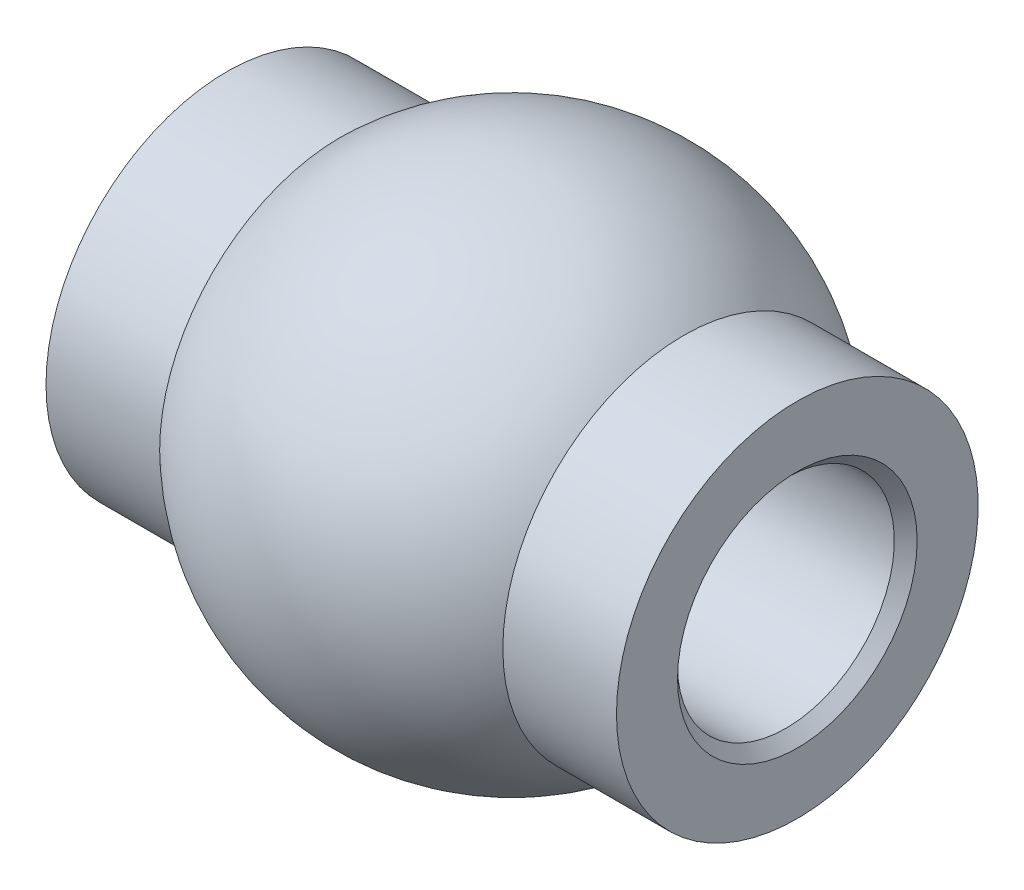
ISO-10303-21;
HEADER;
FILE_DESCRIPTION(('STEP AP214'),'2;1');
FILE_NAME('part.step','',(''),(''),'','','');
FILE_SCHEMA(('AUTOMOTIVE_DESIGN { 1 0 10303 214 1 1 1 1 }'));
ENDSEC;
DATA;
#1=APPLICATION_CONTEXT('core data for automotive mechanical design processes');
#2=APPLICATION_PROTOCOL_DEFINITION('international standard','automotive_design',2000,#1);
#3=PRODUCT_CONTEXT('',#1,'mechanical');
#4=PRODUCT('Part','Part','',(#3));
#5=PRODUCT_RELATED_PRODUCT_CATEGORY('part','',(#4));
#6=PRODUCT_DEFINITION_FORMATION('','',#4);
#7=PRODUCT_DEFINITION_CONTEXT('part definition',#1,'design');
#8=PRODUCT_DEFINITION('design','',#6,#7);
#9=PRODUCT_DEFINITION_SHAPE('','',#8);
#10=(LENGTH_UNIT() NAMED_UNIT(*) SI_UNIT(.MILLI.,.METRE.));
#11=(NAMED_UNIT(*) PLANE_ANGLE_UNIT() SI_UNIT($,.RADIAN.));
#12=(NAMED_UNIT(*) SI_UNIT($,.STERADIAN.) SOLID_ANGLE_UNIT());
#13=UNCERTAINTY_MEASURE_WITH_UNIT(LENGTH_MEASURE(1.E-05),#10,'distance_accuracy_value','');
#14=(GEOMETRIC_REPRESENTATION_CONTEXT(3) GLOBAL_UNCERTAINTY_ASSIGNED_CONTEXT((#13)) GLOBAL_UNIT_ASSIGNED_CONTEXT((#10,
#11,#12)) REPRESENTATION_CONTEXT('',''));
#15=CARTESIAN_POINT('',(0.,0.,0.));
#16=DIRECTION('',(0.,0.,1.));
#17=DIRECTION('',(1.,0.,0.));
#18=AXIS2_PLACEMENT_3D('',#15,#16,#17);
#19=CARTESIAN_POINT('',(-18.1576372828576,0.,0.));
#20=DIRECTION('',(-1.,0.,0.));
#21=DIRECTION('',(0.,0.,1.));
#22=AXIS2_PLACEMENT_3D('',#19,#20,#21);
#23=CYLINDRICAL_SURFACE('',#22,4.0259);
#24=CARTESIAN_POINT('',(-6.35,0.,0.));
#25=DIRECTION('',(-1.,0.,0.));
#26=DIRECTION('',(0.,0.,1.));
#27=AXIS2_PLACEMENT_3D('',#24,#25,#26);
#28=CIRCLE('',#27,4.0259);
#29=CARTESIAN_POINT('',(-6.35,0.,4.0259));
#30=VERTEX_POINT('',#29);
#31=EDGE_CURVE('E73',#30,#30,#28,.T.);
#32=ORIENTED_EDGE('',*,*,#31,.F.);
#33=EDGE_LOOP('',(#32));
#34=FACE_BOUND('',#33,.T.);
#35=CARTESIAN_POINT('',(-3.82014648933781,0.,0.));
#36=DIRECTION('',(-1.,0.,0.));
#37=DIRECTION('',(0.,0.,1.));
#38=AXIS2_PLACEMENT_3D('',#35,#36,#37);
#39=CIRCLE('',#38,4.0259);
#40=CARTESIAN_POINT('',(-3.82014648933781,4.0259,0.));
#41=VERTEX_POINT('',#40);
#42=EDGE_CURVE('E61',#41,#41,#39,.T.);
#43=ORIENTED_EDGE('',*,*,#42,.T.);
#44=EDGE_LOOP('',(#43));
#45=FACE_BOUND('',#44,.T.);
#46=ADVANCED_FACE('F37',(#34,#45),#23,.T.);
#47=CARTESIAN_POINT('',(0.,0.,0.));
#48=DIRECTION('',(-1.,0.,0.));
#49=DIRECTION('',(0.,1.,0.));
#50=AXIS2_PLACEMENT_3D('',#47,#48,#49);
#51=SPHERICAL_SURFACE('',#50,5.5499);
#52=CARTESIAN_POINT('',(3.82014648933781,0.,0.));
#53=DIRECTION('',(-1.,0.,0.));
#54=DIRECTION('',(0.,0.,1.));
#55=AXIS2_PLACEMENT_3D('',#52,#53,#54);
#56=CIRCLE('',#55,4.0259);
#57=CARTESIAN_POINT('',(3.82014648933781,4.0259,0.));
#58=VERTEX_POINT('',#57);
#59=EDGE_CURVE('E65',#58,#58,#56,.T.);
#60=CARTESIAN_POINT('',(-3.82014648933781,4.0259,0.));
#61=CARTESIAN_POINT('',(-3.75647292256511,4.08632169117995,0.));
#62=CARTESIAN_POINT('',(-3.69136374480787,4.14523024825536,0.));
#63=CARTESIAN_POINT('',(-3.5584255541697,4.25989409112417,0.));
#64=CARTESIAN_POINT('',(-3.49059654128878,4.31564937691756,0.));
#65=CARTESIAN_POINT('',(-3.35237006724862,4.42387967414934,0.));
#66=CARTESIAN_POINT('',(-3.2819726060894,4.47635468558773,0.));
#67=CARTESIAN_POINT('',(-3.13876804427305,4.57790671669038,0.));
#68=CARTESIAN_POINT('',(-3.06596094361593,4.62698373635464,0.));
#69=CARTESIAN_POINT('',(-2.91810089603688,4.721629205639,0.));
#70=CARTESIAN_POINT('',(-2.84304794911496,4.76719765525911,0.));
#71=CARTESIAN_POINT('',(-2.69086517533641,4.85472344039663,0.));
#72=CARTESIAN_POINT('',(-2.61373534847979,4.89668077591405,0.));
#73=CARTESIAN_POINT('',(-2.45757242458394,4.97688988068548,0.));
#74=CARTESIAN_POINT('',(-2.37853932754471,5.01514164993949,0.));
#75=CARTESIAN_POINT('',(-2.21874776568355,5.08785352092132,0.));
#76=CARTESIAN_POINT('',(-2.13798930086161,5.12231362264914,0.));
#77=CARTESIAN_POINT('',(-1.97492878730888,5.18736458959396,0.));
#78=CARTESIAN_POINT('',(-1.8926267385781,5.21795545481094,0.));
#79=CARTESIAN_POINT('',(-1.72666431623966,5.27519908996329,0.));
#80=CARTESIAN_POINT('',(-1.643003942632,5.30185185989864,0.));
#81=CARTESIAN_POINT('',(-1.47451318694876,5.35115931003686,0.));
#82=CARTESIAN_POINT('',(-1.38968280487317,5.37381399023972,0.));
#83=CARTESIAN_POINT('',(-1.21904298235289,5.41507426606648,0.));
#84=CARTESIAN_POINT('',(-1.1332335419082,5.43367986169039,0.));
#85=CARTESIAN_POINT('',(-0.960828756561464,5.46680008784064,0.));
#86=CARTESIAN_POINT('',(-0.874233411659423,5.48131471836699,0.));
#87=CARTESIAN_POINT('',(-0.700451740355089,5.50622034242008,0.));
#88=CARTESIAN_POINT('',(-0.613265413952796,5.51661133594681,0.));
#89=CARTESIAN_POINT('',(-0.438498032881969,5.53324629625381,0.));
#90=CARTESIAN_POINT('',(-0.350916978213436,5.53949026303407,0.));
#91=CARTESIAN_POINT('',(-0.175557282363269,5.54781711490717,0.));
#92=CARTESIAN_POINT('',(-0.0877786411816341,5.5499,0.));
#93=CARTESIAN_POINT('',(0.0877786411816353,5.5499,0.));
#94=CARTESIAN_POINT('',(0.17555728236327,5.54781711490717,0.));
#95=CARTESIAN_POINT('',(0.350916978213437,5.53949026303407,0.));
#96=CARTESIAN_POINT('',(0.43849803288197,5.53324629625381,0.));
#97=CARTESIAN_POINT('',(0.613265413952797,5.51661133594681,0.));
#98=CARTESIAN_POINT('',(0.700451740355091,5.50622034242008,0.));
#99=CARTESIAN_POINT('',(0.874233411659424,5.48131471836699,0.));
#100=CARTESIAN_POINT('',(0.960828756561465,5.46680008784064,0.));
#101=CARTESIAN_POINT('',(1.1332335419082,5.43367986169039,0.));
#102=CARTESIAN_POINT('',(1.21904298235289,5.41507426606648,0.));
#103=CARTESIAN_POINT('',(1.38968280487317,5.37381399023972,0.));
#104=CARTESIAN_POINT('',(1.47451318694876,5.35115931003686,0.));
#105=CARTESIAN_POINT('',(1.64300394263201,5.30185185989864,0.));
#106=CARTESIAN_POINT('',(1.72666431623966,5.27519908996329,0.));
#107=CARTESIAN_POINT('',(1.8926267385781,5.21795545481094,0.));
#108=CARTESIAN_POINT('',(1.97492878730888,5.18736458959395,0.));
#109=CARTESIAN_POINT('',(2.13798930086161,5.12231362264914,0.));
#110=CARTESIAN_POINT('',(2.21874776568355,5.08785352092132,0.));
#111=CARTESIAN_POINT('',(2.37853932754472,5.01514164993949,0.));
#112=CARTESIAN_POINT('',(2.45757242458394,4.97688988068548,0.));
#113=CARTESIAN_POINT('',(2.61373534847979,4.89668077591405,0.));
#114=CARTESIAN_POINT('',(2.69086517533641,4.85472344039663,0.));
#115=CARTESIAN_POINT('',(2.84304794911496,4.76719765525911,0.));
#116=CARTESIAN_POINT('',(2.91810089603688,4.721629205639,0.));
#117=CARTESIAN_POINT('',(3.06596094361593,4.62698373635464,0.));
#118=CARTESIAN_POINT('',(3.13876804427305,4.57790671669038,0.));
#119=CARTESIAN_POINT('',(3.2819726060894,4.47635468558773,0.));
#120=CARTESIAN_POINT('',(3.35237006724862,4.42387967414934,0.));
#121=CARTESIAN_POINT('',(3.49059654128878,4.31564937691755,0.));
#122=CARTESIAN_POINT('',(3.5584255541697,4.25989409112417,0.));
#123=CARTESIAN_POINT('',(3.69136374480787,4.14523024825536,0.));
#124=CARTESIAN_POINT('',(3.75647292256511,4.08632169117995,0.));
#125=CARTESIAN_POINT('',(3.82014648933781,4.0259,0.));
#126=B_SPLINE_CURVE_WITH_KNOTS('',3,(#60,#61,#62,#63,#64,#65,#66,#67,#68,#69,#70,#71,#72,#73,
#74,#75,#76,#77,#78,#79,#80,#81,#82,#83,#84,#85,#86,#87,#88,#89,#90,#91,#92,#93,#94,#95,#96,#97,
#98,#99,#100,#101,#102,#103,#104,#105,#106,#107,#108,#109,#110,#111,#112,#113,#114,#115,#116,
#117,#118,#119,#120,#121,#122,#123,#124,#125),.UNSPECIFIED.,.F.,.F.,(4,2,2,2,2,2,2,2,2,2,2,2,2,
2,2,2,2,2,2,2,2,2,2,2,2,2,2,2,2,2,2,2,4),(0.,0.263311228708392,0.526622457416783,
0.789933686125176,1.05324491483357,1.31655614354196,1.57986737225035,1.84317860095874,
2.10648982966713,2.36980105837553,2.63311228708392,2.89642351579231,3.1597347445007,
3.42304597320909,3.68635720191749,3.94966843062588,4.21297965933427,4.47629088804266,
4.73960211675105,5.00291334545945,5.26622457416784,5.52953580287623,5.79284703158462,
6.05615826029301,6.3194694890014,6.5827807177098,6.84609194641819,7.10940317512658,
7.37271440383497,7.63602563254336,7.89933686125175,8.16264808996015,8.42595931866854),.UNSPECIFIED.);
#127=EDGE_CURVE('BSEAM82',#41,#58,#126,.T.);
#128=ORIENTED_EDGE('',*,*,#42,.F.);
#129=ORIENTED_EDGE('',*,*,#59,.T.);
#130=ORIENTED_EDGE('',*,*,#127,.T.);
#131=ORIENTED_EDGE('',*,*,#127,.F.);
#132=EDGE_LOOP('',(#128,#130,#129,#131));
#133=FACE_BOUND('',#132,.T.);
#134=ADVANCED_FACE('F82',(#133),#51,.T.);
#135=CARTESIAN_POINT('',(-18.1576372828576,0.,0.));
#136=DIRECTION('',(-1.,0.,0.));
#137=DIRECTION('',(0.,0.,1.));
#138=AXIS2_PLACEMENT_3D('',#135,#136,#137);
#139=CYLINDRICAL_SURFACE('',#138,4.0259);
#140=ORIENTED_EDGE('',*,*,#59,.F.);
#141=EDGE_LOOP('',(#140));
#142=FACE_BOUND('',#141,.T.);
#143=CARTESIAN_POINT('',(6.35,0.,0.));
#144=DIRECTION('',(-1.,0.,0.));
#145=DIRECTION('',(0.,0.,1.));
#146=AXIS2_PLACEMENT_3D('',#143,#144,#145);
#147=CIRCLE('',#146,4.0259);
#148=CARTESIAN_POINT('',(6.35,0.,4.0259));
#149=VERTEX_POINT('',#148);
#150=EDGE_CURVE('E69',#149,#149,#147,.T.);
#151=ORIENTED_EDGE('',*,*,#150,.T.);
#152=EDGE_LOOP('',(#151));
#153=FACE_BOUND('',#152,.T.);
#154=ADVANCED_FACE('F88',(#142,#153),#139,.T.);
#155=CARTESIAN_POINT('',(6.35,2.413,0.));
#156=DIRECTION('',(-1.,0.,0.));
#157=DIRECTION('',(0.,0.,1.));
#158=AXIS2_PLACEMENT_3D('',#155,#156,#157);
#159=PLANE('',#158);
#160=CARTESIAN_POINT('',(6.35,0.,0.));
#161=DIRECTION('',(-1.,0.,0.));
#162=DIRECTION('',(0.,0.,1.));
#163=AXIS2_PLACEMENT_3D('',#160,#161,#162);
#164=CIRCLE('',#163,2.66700000000001);
#165=CARTESIAN_POINT('',(6.35,0.,2.66700000000001));
#166=VERTEX_POINT('',#165);
#167=EDGE_CURVE('E55',#166,#166,#164,.T.);
#168=ORIENTED_EDGE('',*,*,#167,.T.);
#169=EDGE_LOOP('',(#168));
#170=FACE_BOUND('',#169,.T.);
#171=ORIENTED_EDGE('',*,*,#150,.F.);
#172=EDGE_LOOP('',(#171));
#173=FACE_BOUND('',#172,.T.);
#174=ADVANCED_FACE('F94',(#170,#173),#159,.F.);
#175=CARTESIAN_POINT('',(-18.1576372828576,0.,0.));
#176=DIRECTION('',(-1.,0.,0.));
#177=DIRECTION('',(0.,0.,1.));
#178=AXIS2_PLACEMENT_3D('',#175,#176,#177);
#179=CYLINDRICAL_SURFACE('',#178,2.413);
#180=CARTESIAN_POINT('',(6.096,0.,0.));
#181=DIRECTION('',(-1.,0.,0.));
#182=DIRECTION('',(0.,0.,1.));
#183=AXIS2_PLACEMENT_3D('',#180,#181,#182);
#184=CIRCLE('',#183,2.413);
#185=CARTESIAN_POINT('',(6.096,0.,2.413));
#186=VERTEX_POINT('',#185);
#187=EDGE_CURVE('E45',#186,#186,#184,.F.);
#188=ORIENTED_EDGE('',*,*,#187,.T.);
#189=EDGE_LOOP('',(#188));
#190=FACE_BOUND('',#189,.T.);
#191=CARTESIAN_POINT('',(-6.096,0.,0.));
#192=DIRECTION('',(1.,0.,0.));
#193=DIRECTION('',(0.,0.,-1.));
#194=AXIS2_PLACEMENT_3D('',#191,#192,#193);
#195=CIRCLE('',#194,2.413);
#196=CARTESIAN_POINT('',(-6.096,0.,-2.413));
#197=VERTEX_POINT('',#196);
#198=EDGE_CURVE('E50',#197,#197,#195,.F.);
#199=ORIENTED_EDGE('',*,*,#198,.T.);
#200=EDGE_LOOP('',(#199));
#201=FACE_BOUND('',#200,.T.);
#202=ADVANCED_FACE('F99',(#190,#201),#179,.F.);
#203=CARTESIAN_POINT('',(-6.35,4.0259,0.));
#204=DIRECTION('',(1.,0.,0.));
#205=DIRECTION('',(0.,0.,-1.));
#206=AXIS2_PLACEMENT_3D('',#203,#204,#205);
#207=PLANE('',#206);
#208=CARTESIAN_POINT('',(-6.35,0.,0.));
#209=DIRECTION('',(1.,0.,0.));
#210=DIRECTION('',(0.,0.,-1.));
#211=AXIS2_PLACEMENT_3D('',#208,#209,#210);
#212=CIRCLE('',#211,2.667);
#213=CARTESIAN_POINT('',(-6.35,0.,-2.667));
#214=VERTEX_POINT('',#213);
#215=EDGE_CURVE('E10',#214,#214,#212,.T.);
#216=ORIENTED_EDGE('',*,*,#215,.T.);
#217=EDGE_LOOP('',(#216));
#218=FACE_BOUND('',#217,.T.);
#219=ORIENTED_EDGE('',*,*,#31,.T.);
#220=EDGE_LOOP('',(#219));
#221=FACE_BOUND('',#220,.T.);
#222=ADVANCED_FACE('F78',(#218,#221),#207,.F.);
#223=CARTESIAN_POINT('',(6.35,0.,0.));
#224=DIRECTION('',(1.,0.,0.));
#225=DIRECTION('',(0.,0.,-1.));
#226=AXIS2_PLACEMENT_3D('',#223,#224,#225);
#227=CONICAL_SURFACE('',#226,2.667,0.785398163397456);
#228=ORIENTED_EDGE('',*,*,#187,.F.);
#229=EDGE_LOOP('',(#228));
#230=FACE_BOUND('',#229,.T.);
#231=ORIENTED_EDGE('',*,*,#167,.F.);
#232=EDGE_LOOP('',(#231));
#233=FACE_BOUND('',#232,.T.);
#234=ADVANCED_FACE('F107',(#230,#233),#227,.F.);
#235=CARTESIAN_POINT('',(-6.096,0.,0.));
#236=DIRECTION('',(-1.,0.,0.));
#237=DIRECTION('',(0.,0.,1.));
#238=AXIS2_PLACEMENT_3D('',#235,#236,#237);
#239=CONICAL_SURFACE('',#238,2.413,0.785398163397449);
#240=ORIENTED_EDGE('',*,*,#215,.F.);
#241=EDGE_LOOP('',(#240));
#242=FACE_BOUND('',#241,.T.);
#243=ORIENTED_EDGE('',*,*,#198,.F.);
#244=EDGE_LOOP('',(#243));
#245=FACE_BOUND('',#244,.T.);
#246=ADVANCED_FACE('F39',(#242,#245),#239,.F.);
#247=CLOSED_SHELL('',(#46,#134,#154,#174,#202,#222,#234,#246));
#248=MANIFOLD_SOLID_BREP('B2',#247);
#249=ADVANCED_BREP_SHAPE_REPRESENTATION('',(#18,#248),#14);
#250=SHAPE_DEFINITION_REPRESENTATION(#9,#249);
ENDSEC;
END-ISO-10303-21;
